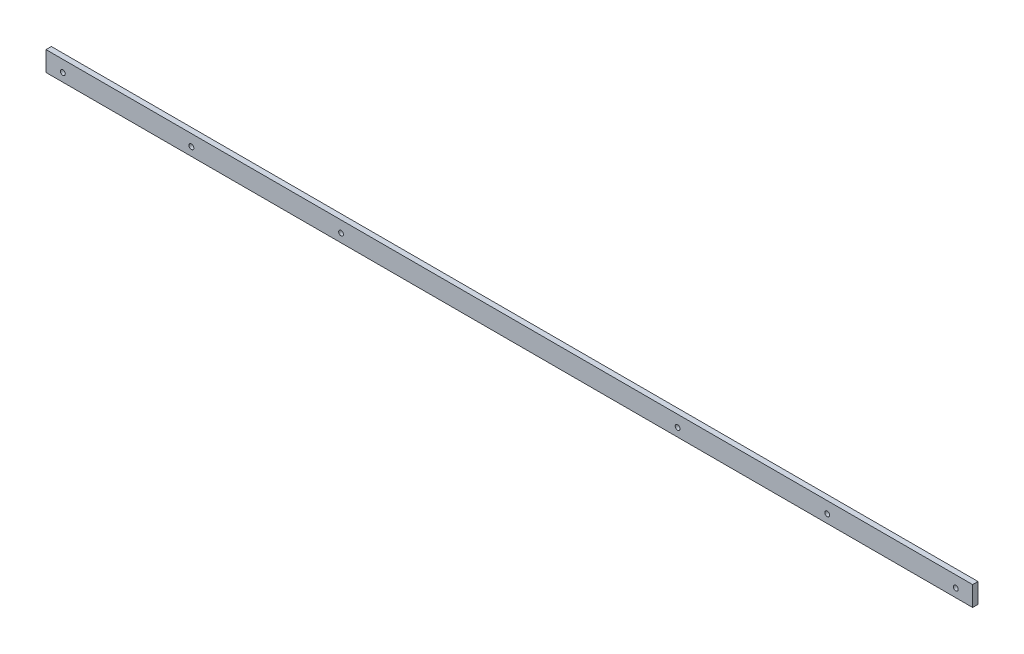
ISO-10303-21;
HEADER;
FILE_DESCRIPTION(('STEP AP214'),'2;1');
FILE_NAME('part.step','',(''),(''),'','','');
FILE_SCHEMA(('AUTOMOTIVE_DESIGN { 1 0 10303 214 1 1 1 1 }'));
ENDSEC;
DATA;
#1=APPLICATION_CONTEXT('core data for automotive mechanical design processes');
#2=APPLICATION_PROTOCOL_DEFINITION('international standard','automotive_design',2000,#1);
#3=PRODUCT_CONTEXT('',#1,'mechanical');
#4=PRODUCT('Part','Part','',(#3));
#5=PRODUCT_RELATED_PRODUCT_CATEGORY('part','',(#4));
#6=PRODUCT_DEFINITION_FORMATION('','',#4);
#7=PRODUCT_DEFINITION_CONTEXT('part definition',#1,'design');
#8=PRODUCT_DEFINITION('design','',#6,#7);
#9=PRODUCT_DEFINITION_SHAPE('','',#8);
#10=(LENGTH_UNIT() NAMED_UNIT(*) SI_UNIT(.MILLI.,.METRE.));
#11=(NAMED_UNIT(*) PLANE_ANGLE_UNIT() SI_UNIT($,.RADIAN.));
#12=(NAMED_UNIT(*) SI_UNIT($,.STERADIAN.) SOLID_ANGLE_UNIT());
#13=UNCERTAINTY_MEASURE_WITH_UNIT(LENGTH_MEASURE(1.E-05),#10,'distance_accuracy_value','');
#14=(GEOMETRIC_REPRESENTATION_CONTEXT(3) GLOBAL_UNCERTAINTY_ASSIGNED_CONTEXT((#13)) GLOBAL_UNIT_ASSIGNED_CONTEXT((#10,
#11,#12)) REPRESENTATION_CONTEXT('',''));
#15=CARTESIAN_POINT('',(0.,0.,0.));
#16=DIRECTION('',(0.,0.,1.));
#17=DIRECTION('',(1.,0.,0.));
#18=AXIS2_PLACEMENT_3D('',#15,#16,#17);
#19=CARTESIAN_POINT('',(275.35,5.9,3.18));
#20=DIRECTION('',(-1.,0.,0.));
#21=DIRECTION('',(0.,0.,1.));
#22=AXIS2_PLACEMENT_3D('',#19,#20,#21);
#23=PLANE('',#22);
#24=DIRECTION('',(0.,1.,0.));
#25=VECTOR('',#24,1.);
#26=CARTESIAN_POINT('',(275.35,5.9,0.));
#27=LINE('',#26,#25);
#28=CARTESIAN_POINT('',(275.35,-5.9,0.));
#29=VERTEX_POINT('',#28);
#30=CARTESIAN_POINT('',(275.35,5.9,0.));
#31=VERTEX_POINT('',#30);
#32=EDGE_CURVE('E100',#29,#31,#27,.T.);
#33=ORIENTED_EDGE('',*,*,#32,.T.);
#34=DIRECTION('',(0.,0.,-1.));
#35=VECTOR('',#34,1.);
#36=CARTESIAN_POINT('',(275.35,5.9,3.18));
#37=LINE('',#36,#35);
#38=CARTESIAN_POINT('',(275.35,5.9,3.18));
#39=VERTEX_POINT('',#38);
#40=EDGE_CURVE('E11',#39,#31,#37,.T.);
#41=ORIENTED_EDGE('',*,*,#40,.F.);
#42=DIRECTION('',(0.,1.,0.));
#43=VECTOR('',#42,1.);
#44=CARTESIAN_POINT('',(275.35,5.9,3.18));
#45=LINE('',#44,#43);
#46=CARTESIAN_POINT('',(275.35,-5.9,3.18));
#47=VERTEX_POINT('',#46);
#48=EDGE_CURVE('E88',#47,#39,#45,.T.);
#49=ORIENTED_EDGE('',*,*,#48,.F.);
#50=DIRECTION('',(0.,0.,-1.));
#51=VECTOR('',#50,1.);
#52=CARTESIAN_POINT('',(275.35,-5.9,3.18));
#53=LINE('',#52,#51);
#54=EDGE_CURVE('E96',#47,#29,#53,.T.);
#55=ORIENTED_EDGE('',*,*,#54,.T.);
#56=EDGE_LOOP('',(#33,#41,#49,#55));
#57=FACE_BOUND('',#56,.T.);
#58=ADVANCED_FACE('F37',(#57),#23,.F.);
#59=CARTESIAN_POINT('',(-275.35,5.9,3.18));
#60=DIRECTION('',(0.,-1.,0.));
#61=DIRECTION('',(0.,0.,-1.));
#62=AXIS2_PLACEMENT_3D('',#59,#60,#61);
#63=PLANE('',#62);
#64=DIRECTION('',(-1.,0.,0.));
#65=VECTOR('',#64,1.);
#66=CARTESIAN_POINT('',(-275.35,5.9,0.));
#67=LINE('',#66,#65);
#68=CARTESIAN_POINT('',(-275.35,5.9,0.));
#69=VERTEX_POINT('',#68);
#70=EDGE_CURVE('E92',#31,#69,#67,.T.);
#71=ORIENTED_EDGE('',*,*,#70,.T.);
#72=DIRECTION('',(0.,0.,-1.));
#73=VECTOR('',#72,1.);
#74=CARTESIAN_POINT('',(-275.35,5.9,3.18));
#75=LINE('',#74,#73);
#76=CARTESIAN_POINT('',(-275.35,5.9,3.18));
#77=VERTEX_POINT('',#76);
#78=EDGE_CURVE('E45',#77,#69,#75,.T.);
#79=ORIENTED_EDGE('',*,*,#78,.F.);
#80=DIRECTION('',(-1.,0.,0.));
#81=VECTOR('',#80,1.);
#82=CARTESIAN_POINT('',(-275.35,5.9,3.18));
#83=LINE('',#82,#81);
#84=EDGE_CURVE('E83',#39,#77,#83,.T.);
#85=ORIENTED_EDGE('',*,*,#84,.F.);
#86=ORIENTED_EDGE('',*,*,#40,.T.);
#87=EDGE_LOOP('',(#71,#79,#85,#86));
#88=FACE_BOUND('',#87,.T.);
#89=ADVANCED_FACE('F91',(#88),#63,.F.);
#90=CARTESIAN_POINT('',(-275.35,5.9,3.18));
#91=DIRECTION('',(1.,0.,0.));
#92=DIRECTION('',(0.,0.,-1.));
#93=AXIS2_PLACEMENT_3D('',#90,#91,#92);
#94=PLANE('',#93);
#95=DIRECTION('',(0.,-1.,0.));
#96=VECTOR('',#95,1.);
#97=CARTESIAN_POINT('',(-275.35,5.9,0.));
#98=LINE('',#97,#96);
#99=CARTESIAN_POINT('',(-275.35,-5.9,0.));
#100=VERTEX_POINT('',#99);
#101=EDGE_CURVE('E70',#69,#100,#98,.T.);
#102=ORIENTED_EDGE('',*,*,#101,.T.);
#103=DIRECTION('',(0.,0.,-1.));
#104=VECTOR('',#103,1.);
#105=CARTESIAN_POINT('',(-275.35,-5.9,3.18));
#106=LINE('',#105,#104);
#107=CARTESIAN_POINT('',(-275.35,-5.9,3.18));
#108=VERTEX_POINT('',#107);
#109=EDGE_CURVE('E93',#108,#100,#106,.T.);
#110=ORIENTED_EDGE('',*,*,#109,.F.);
#111=DIRECTION('',(0.,-1.,0.));
#112=VECTOR('',#111,1.);
#113=CARTESIAN_POINT('',(-275.35,5.9,3.18));
#114=LINE('',#113,#112);
#115=EDGE_CURVE('E86',#77,#108,#114,.T.);
#116=ORIENTED_EDGE('',*,*,#115,.F.);
#117=ORIENTED_EDGE('',*,*,#78,.T.);
#118=EDGE_LOOP('',(#102,#110,#116,#117));
#119=FACE_BOUND('',#118,.T.);
#120=ADVANCED_FACE('F94',(#119),#94,.F.);
#121=CARTESIAN_POINT('',(-275.35,-5.9,3.18));
#122=DIRECTION('',(0.,1.,0.));
#123=DIRECTION('',(0.,0.,1.));
#124=AXIS2_PLACEMENT_3D('',#121,#122,#123);
#125=PLANE('',#124);
#126=DIRECTION('',(1.,0.,0.));
#127=VECTOR('',#126,1.);
#128=CARTESIAN_POINT('',(-275.35,-5.9,0.));
#129=LINE('',#128,#127);
#130=EDGE_CURVE('E76',#100,#29,#129,.T.);
#131=ORIENTED_EDGE('',*,*,#130,.T.);
#132=ORIENTED_EDGE('',*,*,#54,.F.);
#133=DIRECTION('',(1.,0.,0.));
#134=VECTOR('',#133,1.);
#135=CARTESIAN_POINT('',(-275.35,-5.9,3.18));
#136=LINE('',#135,#134);
#137=EDGE_CURVE('E53',#108,#47,#136,.T.);
#138=ORIENTED_EDGE('',*,*,#137,.F.);
#139=ORIENTED_EDGE('',*,*,#109,.T.);
#140=EDGE_LOOP('',(#131,#132,#138,#139));
#141=FACE_BOUND('',#140,.T.);
#142=ADVANCED_FACE('F108',(#141),#125,.F.);
#143=CARTESIAN_POINT('',(0.,0.,3.18));
#144=DIRECTION('',(0.,0.,1.));
#145=DIRECTION('',(1.,0.,0.));
#146=AXIS2_PLACEMENT_3D('',#143,#144,#145);
#147=PLANE('',#146);
#148=CARTESIAN_POINT('',(188.94,-0.900000000000001,3.18));
#149=DIRECTION('',(0.,0.,-1.));
#150=DIRECTION('',(-1.,0.,0.));
#151=AXIS2_PLACEMENT_3D('',#148,#149,#150);
#152=CIRCLE('',#151,1.45);
#153=CARTESIAN_POINT('',(190.39,-0.900000000000001,3.18));
#154=VERTEX_POINT('',#153);
#155=EDGE_CURVE('E143',#154,#154,#152,.T.);
#156=ORIENTED_EDGE('',*,*,#155,.T.);
#157=EDGE_LOOP('',(#156));
#158=FACE_BOUND('',#157,.T.);
#159=CARTESIAN_POINT('',(-188.94,-0.900000000000001,3.18));
#160=DIRECTION('',(0.,0.,1.));
#161=DIRECTION('',(1.,0.,0.));
#162=AXIS2_PLACEMENT_3D('',#159,#160,#161);
#163=CIRCLE('',#162,1.45);
#164=CARTESIAN_POINT('',(-187.49,-0.900000000000001,3.18));
#165=VERTEX_POINT('',#164);
#166=EDGE_CURVE('E140',#165,#165,#163,.T.);
#167=ORIENTED_EDGE('',*,*,#166,.F.);
#168=EDGE_LOOP('',(#167));
#169=FACE_BOUND('',#168,.T.);
#170=CARTESIAN_POINT('',(-265.35,-0.900000000000001,3.18));
#171=DIRECTION('',(0.,0.,-1.));
#172=DIRECTION('',(-1.,0.,0.));
#173=AXIS2_PLACEMENT_3D('',#170,#171,#172);
#174=CIRCLE('',#173,1.45);
#175=CARTESIAN_POINT('',(-263.9,-0.900000000000001,3.18));
#176=VERTEX_POINT('',#175);
#177=EDGE_CURVE('E131',#176,#176,#174,.T.);
#178=ORIENTED_EDGE('',*,*,#177,.T.);
#179=EDGE_LOOP('',(#178));
#180=FACE_BOUND('',#179,.T.);
#181=CARTESIAN_POINT('',(265.35,-0.900000000000001,3.18));
#182=DIRECTION('',(0.,0.,1.));
#183=DIRECTION('',(1.,0.,0.));
#184=AXIS2_PLACEMENT_3D('',#181,#182,#183);
#185=CIRCLE('',#184,1.45);
#186=CARTESIAN_POINT('',(266.8,-0.900000000000001,3.18));
#187=VERTEX_POINT('',#186);
#188=EDGE_CURVE('E128',#187,#187,#185,.T.);
#189=ORIENTED_EDGE('',*,*,#188,.F.);
#190=EDGE_LOOP('',(#189));
#191=FACE_BOUND('',#190,.T.);
#192=CARTESIAN_POINT('',(-100.,-0.900000000000001,3.18));
#193=DIRECTION('',(0.,0.,-1.));
#194=DIRECTION('',(-1.,0.,0.));
#195=AXIS2_PLACEMENT_3D('',#192,#193,#194);
#196=CIRCLE('',#195,1.425);
#197=CARTESIAN_POINT('',(-98.575,-0.900000000000001,3.18));
#198=VERTEX_POINT('',#197);
#199=EDGE_CURVE('E119',#198,#198,#196,.T.);
#200=ORIENTED_EDGE('',*,*,#199,.T.);
#201=EDGE_LOOP('',(#200));
#202=FACE_BOUND('',#201,.T.);
#203=CARTESIAN_POINT('',(100.,-0.900000000000001,3.18));
#204=DIRECTION('',(0.,0.,1.));
#205=DIRECTION('',(1.,0.,0.));
#206=AXIS2_PLACEMENT_3D('',#203,#204,#205);
#207=CIRCLE('',#206,1.425);
#208=CARTESIAN_POINT('',(101.425,-0.900000000000001,3.18));
#209=VERTEX_POINT('',#208);
#210=EDGE_CURVE('E116',#209,#209,#207,.T.);
#211=ORIENTED_EDGE('',*,*,#210,.F.);
#212=EDGE_LOOP('',(#211));
#213=FACE_BOUND('',#212,.T.);
#214=ORIENTED_EDGE('',*,*,#48,.T.);
#215=ORIENTED_EDGE('',*,*,#84,.T.);
#216=ORIENTED_EDGE('',*,*,#115,.T.);
#217=ORIENTED_EDGE('',*,*,#137,.T.);
#218=EDGE_LOOP('',(#214,#215,#216,#217));
#219=FACE_BOUND('',#218,.T.);
#220=ADVANCED_FACE('F84',(#158,#169,#180,#191,#202,#213,#219),#147,.T.);
#221=CARTESIAN_POINT('',(0.,0.,0.));
#222=DIRECTION('',(0.,0.,1.));
#223=DIRECTION('',(1.,0.,0.));
#224=AXIS2_PLACEMENT_3D('',#221,#222,#223);
#225=PLANE('',#224);
#226=CARTESIAN_POINT('',(188.94,-0.900000000000001,0.));
#227=DIRECTION('',(0.,0.,1.));
#228=DIRECTION('',(1.,0.,0.));
#229=AXIS2_PLACEMENT_3D('',#226,#227,#228);
#230=CIRCLE('',#229,1.45);
#231=CARTESIAN_POINT('',(190.39,-0.900000000000001,0.));
#232=VERTEX_POINT('',#231);
#233=EDGE_CURVE('E144',#232,#232,#230,.T.);
#234=ORIENTED_EDGE('',*,*,#233,.T.);
#235=EDGE_LOOP('',(#234));
#236=FACE_BOUND('',#235,.T.);
#237=CARTESIAN_POINT('',(-188.94,-0.900000000000001,0.));
#238=DIRECTION('',(0.,0.,1.));
#239=DIRECTION('',(1.,0.,0.));
#240=AXIS2_PLACEMENT_3D('',#237,#238,#239);
#241=CIRCLE('',#240,1.45);
#242=CARTESIAN_POINT('',(-187.49,-0.900000000000001,0.));
#243=VERTEX_POINT('',#242);
#244=EDGE_CURVE('E135',#243,#243,#241,.F.);
#245=ORIENTED_EDGE('',*,*,#244,.F.);
#246=EDGE_LOOP('',(#245));
#247=FACE_BOUND('',#246,.T.);
#248=CARTESIAN_POINT('',(-265.35,-0.900000000000001,0.));
#249=DIRECTION('',(0.,0.,1.));
#250=DIRECTION('',(1.,0.,0.));
#251=AXIS2_PLACEMENT_3D('',#248,#249,#250);
#252=CIRCLE('',#251,1.45);
#253=CARTESIAN_POINT('',(-263.9,-0.900000000000001,0.));
#254=VERTEX_POINT('',#253);
#255=EDGE_CURVE('E132',#254,#254,#252,.T.);
#256=ORIENTED_EDGE('',*,*,#255,.T.);
#257=EDGE_LOOP('',(#256));
#258=FACE_BOUND('',#257,.T.);
#259=CARTESIAN_POINT('',(265.35,-0.900000000000001,0.));
#260=DIRECTION('',(0.,0.,1.));
#261=DIRECTION('',(1.,0.,0.));
#262=AXIS2_PLACEMENT_3D('',#259,#260,#261);
#263=CIRCLE('',#262,1.45);
#264=CARTESIAN_POINT('',(266.8,-0.900000000000001,0.));
#265=VERTEX_POINT('',#264);
#266=EDGE_CURVE('E123',#265,#265,#263,.F.);
#267=ORIENTED_EDGE('',*,*,#266,.F.);
#268=EDGE_LOOP('',(#267));
#269=FACE_BOUND('',#268,.T.);
#270=CARTESIAN_POINT('',(-100.,-0.900000000000001,0.));
#271=DIRECTION('',(0.,0.,1.));
#272=DIRECTION('',(1.,0.,0.));
#273=AXIS2_PLACEMENT_3D('',#270,#271,#272);
#274=CIRCLE('',#273,1.425);
#275=CARTESIAN_POINT('',(-98.575,-0.900000000000001,0.));
#276=VERTEX_POINT('',#275);
#277=EDGE_CURVE('E120',#276,#276,#274,.T.);
#278=ORIENTED_EDGE('',*,*,#277,.T.);
#279=EDGE_LOOP('',(#278));
#280=FACE_BOUND('',#279,.T.);
#281=CARTESIAN_POINT('',(100.,-0.900000000000001,0.));
#282=DIRECTION('',(0.,0.,1.));
#283=DIRECTION('',(1.,0.,0.));
#284=AXIS2_PLACEMENT_3D('',#281,#282,#283);
#285=CIRCLE('',#284,1.425);
#286=CARTESIAN_POINT('',(101.425,-0.900000000000001,0.));
#287=VERTEX_POINT('',#286);
#288=EDGE_CURVE('E103',#287,#287,#285,.F.);
#289=ORIENTED_EDGE('',*,*,#288,.F.);
#290=EDGE_LOOP('',(#289));
#291=FACE_BOUND('',#290,.T.);
#292=ORIENTED_EDGE('',*,*,#32,.F.);
#293=ORIENTED_EDGE('',*,*,#130,.F.);
#294=ORIENTED_EDGE('',*,*,#101,.F.);
#295=ORIENTED_EDGE('',*,*,#70,.F.);
#296=EDGE_LOOP('',(#292,#293,#294,#295));
#297=FACE_BOUND('',#296,.T.);
#298=ADVANCED_FACE('F111',(#236,#247,#258,#269,#280,#291,#297),#225,.F.);
#299=CARTESIAN_POINT('',(100.,-0.900000000000001,-0.00100000000000013));
#300=DIRECTION('',(0.,0.,1.));
#301=DIRECTION('',(1.,0.,0.));
#302=AXIS2_PLACEMENT_3D('',#299,#300,#301);
#303=CYLINDRICAL_SURFACE('',#302,1.425);
#304=CARTESIAN_POINT('',(101.425,-0.900000000000001,3.18));
#305=CARTESIAN_POINT('',(101.425,-0.900000000000001,3.146875));
#306=CARTESIAN_POINT('',(101.425,-0.900000000000001,3.11375));
#307=CARTESIAN_POINT('',(101.425,-0.900000000000001,3.0475));
#308=CARTESIAN_POINT('',(101.425,-0.900000000000001,3.014375));
#309=CARTESIAN_POINT('',(101.425,-0.900000000000001,2.948125));
#310=CARTESIAN_POINT('',(101.425,-0.900000000000001,2.915));
#311=CARTESIAN_POINT('',(101.425,-0.900000000000001,2.84875));
#312=CARTESIAN_POINT('',(101.425,-0.900000000000001,2.815625));
#313=CARTESIAN_POINT('',(101.425,-0.900000000000001,2.749375));
#314=CARTESIAN_POINT('',(101.425,-0.900000000000001,2.71625));
#315=CARTESIAN_POINT('',(101.425,-0.900000000000001,2.65));
#316=CARTESIAN_POINT('',(101.425,-0.900000000000001,2.616875));
#317=CARTESIAN_POINT('',(101.425,-0.900000000000001,2.550625));
#318=CARTESIAN_POINT('',(101.425,-0.900000000000001,2.5175));
#319=CARTESIAN_POINT('',(101.425,-0.900000000000001,2.45125));
#320=CARTESIAN_POINT('',(101.425,-0.900000000000001,2.418125));
#321=CARTESIAN_POINT('',(101.425,-0.900000000000001,2.351875));
#322=CARTESIAN_POINT('',(101.425,-0.900000000000001,2.31875));
#323=CARTESIAN_POINT('',(101.425,-0.900000000000001,2.2525));
#324=CARTESIAN_POINT('',(101.425,-0.900000000000001,2.219375));
#325=CARTESIAN_POINT('',(101.425,-0.900000000000001,2.153125));
#326=CARTESIAN_POINT('',(101.425,-0.900000000000001,2.12));
#327=CARTESIAN_POINT('',(101.425,-0.900000000000001,2.05375));
#328=CARTESIAN_POINT('',(101.425,-0.900000000000001,2.020625));
#329=CARTESIAN_POINT('',(101.425,-0.900000000000001,1.954375));
#330=CARTESIAN_POINT('',(101.425,-0.900000000000001,1.92125));
#331=CARTESIAN_POINT('',(101.425,-0.900000000000001,1.855));
#332=CARTESIAN_POINT('',(101.425,-0.900000000000001,1.821875));
#333=CARTESIAN_POINT('',(101.425,-0.900000000000001,1.755625));
#334=CARTESIAN_POINT('',(101.425,-0.900000000000001,1.7225));
#335=CARTESIAN_POINT('',(101.425,-0.900000000000001,1.65625));
#336=CARTESIAN_POINT('',(101.425,-0.900000000000001,1.623125));
#337=CARTESIAN_POINT('',(101.425,-0.900000000000001,1.556875));
#338=CARTESIAN_POINT('',(101.425,-0.900000000000001,1.52375));
#339=CARTESIAN_POINT('',(101.425,-0.900000000000001,1.4575));
#340=CARTESIAN_POINT('',(101.425,-0.900000000000001,1.424375));
#341=CARTESIAN_POINT('',(101.425,-0.900000000000001,1.358125));
#342=CARTESIAN_POINT('',(101.425,-0.900000000000001,1.325));
#343=CARTESIAN_POINT('',(101.425,-0.900000000000001,1.25875));
#344=CARTESIAN_POINT('',(101.425,-0.900000000000001,1.225625));
#345=CARTESIAN_POINT('',(101.425,-0.900000000000001,1.159375));
#346=CARTESIAN_POINT('',(101.425,-0.900000000000001,1.12625));
#347=CARTESIAN_POINT('',(101.425,-0.900000000000001,1.06));
#348=CARTESIAN_POINT('',(101.425,-0.900000000000001,1.026875));
#349=CARTESIAN_POINT('',(101.425,-0.900000000000001,0.960625));
#350=CARTESIAN_POINT('',(101.425,-0.900000000000001,0.9275));
#351=CARTESIAN_POINT('',(101.425,-0.900000000000001,0.86125));
#352=CARTESIAN_POINT('',(101.425,-0.900000000000001,0.828125));
#353=CARTESIAN_POINT('',(101.425,-0.900000000000001,0.761875));
#354=CARTESIAN_POINT('',(101.425,-0.900000000000001,0.72875));
#355=CARTESIAN_POINT('',(101.425,-0.900000000000001,0.6625));
#356=CARTESIAN_POINT('',(101.425,-0.900000000000001,0.629375));
#357=CARTESIAN_POINT('',(101.425,-0.900000000000001,0.563125));
#358=CARTESIAN_POINT('',(101.425,-0.900000000000001,0.53));
#359=CARTESIAN_POINT('',(101.425,-0.900000000000001,0.46375));
#360=CARTESIAN_POINT('',(101.425,-0.900000000000001,0.430625));
#361=CARTESIAN_POINT('',(101.425,-0.900000000000001,0.364375));
#362=CARTESIAN_POINT('',(101.425,-0.900000000000001,0.33125));
#363=CARTESIAN_POINT('',(101.425,-0.900000000000001,0.265));
#364=CARTESIAN_POINT('',(101.425,-0.900000000000001,0.231875));
#365=CARTESIAN_POINT('',(101.425,-0.900000000000001,0.165625));
#366=CARTESIAN_POINT('',(101.425,-0.900000000000001,0.1325));
#367=CARTESIAN_POINT('',(101.425,-0.900000000000001,0.06625));
#368=CARTESIAN_POINT('',(101.425,-0.900000000000001,0.033125));
#369=CARTESIAN_POINT('',(101.425,-0.900000000000001,0.));
#370=B_SPLINE_CURVE_WITH_KNOTS('',3,(#304,#305,#306,#307,#308,#309,#310,#311,#312,#313,#314,
#315,#316,#317,#318,#319,#320,#321,#322,#323,#324,#325,#326,#327,#328,#329,#330,#331,#332,#333,
#334,#335,#336,#337,#338,#339,#340,#341,#342,#343,#344,#345,#346,#347,#348,#349,#350,#351,#352,
#353,#354,#355,#356,#357,#358,#359,#360,#361,#362,#363,#364,#365,#366,#367,#368,#369),
.UNSPECIFIED.,.F.,.F.,(4,2,2,2,2,2,2,2,2,2,2,2,2,2,2,2,2,2,2,2,2,2,2,2,2,2,2,2,2,2,2,2,4),(0.,
0.0993750000000001,0.19875,0.298125,0.3975,0.496875,0.59625,0.695625,0.795,0.894375,0.99375,
1.093125,1.1925,1.291875,1.39125,1.490625,1.59,1.689375,1.78875,1.888125,1.9875,2.086875,
2.18625,2.285625,2.385,2.484375,2.58375,2.683125,2.7825,2.881875,2.98125,3.080625,3.18),.UNSPECIFIED.);
#371=EDGE_CURVE('BSEAM161',#209,#287,#370,.T.);
#372=ORIENTED_EDGE('',*,*,#210,.T.);
#373=ORIENTED_EDGE('',*,*,#288,.T.);
#374=ORIENTED_EDGE('',*,*,#371,.T.);
#375=ORIENTED_EDGE('',*,*,#371,.F.);
#376=EDGE_LOOP('',(#372,#374,#373,#375));
#377=FACE_BOUND('',#376,.T.);
#378=ADVANCED_FACE('F161',(#377),#303,.F.);
#379=CARTESIAN_POINT('',(-100.,-0.900000000000001,-0.00100000000000013));
#380=DIRECTION('',(0.,0.,1.));
#381=DIRECTION('',(1.,0.,0.));
#382=AXIS2_PLACEMENT_3D('',#379,#380,#381);
#383=CYLINDRICAL_SURFACE('',#382,1.425);
#384=CARTESIAN_POINT('',(-98.575,-0.900000000000001,3.18));
#385=CARTESIAN_POINT('',(-98.575,-0.900000000000001,3.146875));
#386=CARTESIAN_POINT('',(-98.575,-0.900000000000001,3.11375));
#387=CARTESIAN_POINT('',(-98.575,-0.900000000000001,3.0475));
#388=CARTESIAN_POINT('',(-98.575,-0.900000000000001,3.014375));
#389=CARTESIAN_POINT('',(-98.575,-0.900000000000001,2.948125));
#390=CARTESIAN_POINT('',(-98.575,-0.900000000000001,2.915));
#391=CARTESIAN_POINT('',(-98.575,-0.900000000000001,2.84875));
#392=CARTESIAN_POINT('',(-98.575,-0.900000000000001,2.815625));
#393=CARTESIAN_POINT('',(-98.575,-0.900000000000001,2.749375));
#394=CARTESIAN_POINT('',(-98.575,-0.900000000000001,2.71625));
#395=CARTESIAN_POINT('',(-98.575,-0.900000000000001,2.65));
#396=CARTESIAN_POINT('',(-98.575,-0.900000000000001,2.616875));
#397=CARTESIAN_POINT('',(-98.575,-0.900000000000001,2.550625));
#398=CARTESIAN_POINT('',(-98.575,-0.900000000000001,2.5175));
#399=CARTESIAN_POINT('',(-98.575,-0.900000000000001,2.45125));
#400=CARTESIAN_POINT('',(-98.575,-0.900000000000001,2.418125));
#401=CARTESIAN_POINT('',(-98.575,-0.900000000000001,2.351875));
#402=CARTESIAN_POINT('',(-98.575,-0.900000000000001,2.31875));
#403=CARTESIAN_POINT('',(-98.575,-0.900000000000001,2.2525));
#404=CARTESIAN_POINT('',(-98.575,-0.900000000000001,2.219375));
#405=CARTESIAN_POINT('',(-98.575,-0.900000000000001,2.153125));
#406=CARTESIAN_POINT('',(-98.575,-0.900000000000001,2.12));
#407=CARTESIAN_POINT('',(-98.575,-0.900000000000001,2.05375));
#408=CARTESIAN_POINT('',(-98.575,-0.900000000000001,2.020625));
#409=CARTESIAN_POINT('',(-98.575,-0.900000000000001,1.954375));
#410=CARTESIAN_POINT('',(-98.575,-0.900000000000001,1.92125));
#411=CARTESIAN_POINT('',(-98.575,-0.900000000000001,1.855));
#412=CARTESIAN_POINT('',(-98.575,-0.900000000000001,1.821875));
#413=CARTESIAN_POINT('',(-98.575,-0.900000000000001,1.755625));
#414=CARTESIAN_POINT('',(-98.575,-0.900000000000001,1.7225));
#415=CARTESIAN_POINT('',(-98.575,-0.900000000000001,1.65625));
#416=CARTESIAN_POINT('',(-98.575,-0.900000000000001,1.623125));
#417=CARTESIAN_POINT('',(-98.575,-0.900000000000001,1.556875));
#418=CARTESIAN_POINT('',(-98.575,-0.900000000000001,1.52375));
#419=CARTESIAN_POINT('',(-98.575,-0.900000000000001,1.4575));
#420=CARTESIAN_POINT('',(-98.575,-0.900000000000001,1.424375));
#421=CARTESIAN_POINT('',(-98.575,-0.900000000000001,1.358125));
#422=CARTESIAN_POINT('',(-98.575,-0.900000000000001,1.325));
#423=CARTESIAN_POINT('',(-98.575,-0.900000000000001,1.25875));
#424=CARTESIAN_POINT('',(-98.575,-0.900000000000001,1.225625));
#425=CARTESIAN_POINT('',(-98.575,-0.900000000000001,1.159375));
#426=CARTESIAN_POINT('',(-98.575,-0.900000000000001,1.12625));
#427=CARTESIAN_POINT('',(-98.575,-0.900000000000001,1.06));
#428=CARTESIAN_POINT('',(-98.575,-0.900000000000001,1.026875));
#429=CARTESIAN_POINT('',(-98.575,-0.900000000000001,0.960625));
#430=CARTESIAN_POINT('',(-98.575,-0.900000000000001,0.9275));
#431=CARTESIAN_POINT('',(-98.575,-0.900000000000001,0.86125));
#432=CARTESIAN_POINT('',(-98.575,-0.900000000000001,0.828125));
#433=CARTESIAN_POINT('',(-98.575,-0.900000000000001,0.761875));
#434=CARTESIAN_POINT('',(-98.575,-0.900000000000001,0.72875));
#435=CARTESIAN_POINT('',(-98.575,-0.900000000000001,0.6625));
#436=CARTESIAN_POINT('',(-98.575,-0.900000000000001,0.629375));
#437=CARTESIAN_POINT('',(-98.575,-0.900000000000001,0.563125));
#438=CARTESIAN_POINT('',(-98.575,-0.900000000000001,0.53));
#439=CARTESIAN_POINT('',(-98.575,-0.900000000000001,0.46375));
#440=CARTESIAN_POINT('',(-98.575,-0.900000000000001,0.430625));
#441=CARTESIAN_POINT('',(-98.575,-0.900000000000001,0.364375));
#442=CARTESIAN_POINT('',(-98.575,-0.900000000000001,0.33125));
#443=CARTESIAN_POINT('',(-98.575,-0.900000000000001,0.265));
#444=CARTESIAN_POINT('',(-98.575,-0.900000000000001,0.231875));
#445=CARTESIAN_POINT('',(-98.575,-0.900000000000001,0.165625));
#446=CARTESIAN_POINT('',(-98.575,-0.900000000000001,0.1325));
#447=CARTESIAN_POINT('',(-98.575,-0.900000000000001,0.06625));
#448=CARTESIAN_POINT('',(-98.575,-0.900000000000001,0.033125));
#449=CARTESIAN_POINT('',(-98.575,-0.900000000000001,0.));
#450=B_SPLINE_CURVE_WITH_KNOTS('',3,(#384,#385,#386,#387,#388,#389,#390,#391,#392,#393,#394,
#395,#396,#397,#398,#399,#400,#401,#402,#403,#404,#405,#406,#407,#408,#409,#410,#411,#412,#413,
#414,#415,#416,#417,#418,#419,#420,#421,#422,#423,#424,#425,#426,#427,#428,#429,#430,#431,#432,
#433,#434,#435,#436,#437,#438,#439,#440,#441,#442,#443,#444,#445,#446,#447,#448,#449),
.UNSPECIFIED.,.F.,.F.,(4,2,2,2,2,2,2,2,2,2,2,2,2,2,2,2,2,2,2,2,2,2,2,2,2,2,2,2,2,2,2,2,4),(0.,
0.0993750000000001,0.19875,0.298125,0.3975,0.496875,0.59625,0.695625,0.795,0.894375,0.99375,
1.093125,1.1925,1.291875,1.39125,1.490625,1.59,1.689375,1.78875,1.888125,1.9875,2.086875,
2.18625,2.285625,2.385,2.484375,2.58375,2.683125,2.7825,2.881875,2.98125,3.080625,3.18),.UNSPECIFIED.);
#451=EDGE_CURVE('BSEAM174',#198,#276,#450,.T.);
#452=ORIENTED_EDGE('',*,*,#199,.F.);
#453=ORIENTED_EDGE('',*,*,#277,.F.);
#454=ORIENTED_EDGE('',*,*,#451,.T.);
#455=ORIENTED_EDGE('',*,*,#451,.F.);
#456=EDGE_LOOP('',(#452,#454,#453,#455));
#457=FACE_BOUND('',#456,.T.);
#458=ADVANCED_FACE('F174',(#457),#383,.F.);
#459=CARTESIAN_POINT('',(265.35,-0.900000000000001,-0.00100000000000013));
#460=DIRECTION('',(0.,0.,1.));
#461=DIRECTION('',(1.,0.,0.));
#462=AXIS2_PLACEMENT_3D('',#459,#460,#461);
#463=CYLINDRICAL_SURFACE('',#462,1.45);
#464=CARTESIAN_POINT('',(266.8,-0.900000000000001,3.18));
#465=CARTESIAN_POINT('',(266.8,-0.900000000000001,3.146875));
#466=CARTESIAN_POINT('',(266.8,-0.900000000000001,3.11375));
#467=CARTESIAN_POINT('',(266.8,-0.900000000000001,3.0475));
#468=CARTESIAN_POINT('',(266.8,-0.900000000000001,3.014375));
#469=CARTESIAN_POINT('',(266.8,-0.900000000000001,2.948125));
#470=CARTESIAN_POINT('',(266.8,-0.900000000000001,2.915));
#471=CARTESIAN_POINT('',(266.8,-0.900000000000001,2.84875));
#472=CARTESIAN_POINT('',(266.8,-0.900000000000001,2.815625));
#473=CARTESIAN_POINT('',(266.8,-0.900000000000001,2.749375));
#474=CARTESIAN_POINT('',(266.8,-0.900000000000001,2.71625));
#475=CARTESIAN_POINT('',(266.8,-0.900000000000001,2.65));
#476=CARTESIAN_POINT('',(266.8,-0.900000000000001,2.616875));
#477=CARTESIAN_POINT('',(266.8,-0.900000000000001,2.550625));
#478=CARTESIAN_POINT('',(266.8,-0.900000000000001,2.5175));
#479=CARTESIAN_POINT('',(266.8,-0.900000000000001,2.45125));
#480=CARTESIAN_POINT('',(266.8,-0.900000000000001,2.418125));
#481=CARTESIAN_POINT('',(266.8,-0.900000000000001,2.351875));
#482=CARTESIAN_POINT('',(266.8,-0.900000000000001,2.31875));
#483=CARTESIAN_POINT('',(266.8,-0.900000000000001,2.2525));
#484=CARTESIAN_POINT('',(266.8,-0.900000000000001,2.219375));
#485=CARTESIAN_POINT('',(266.8,-0.900000000000001,2.153125));
#486=CARTESIAN_POINT('',(266.8,-0.900000000000001,2.12));
#487=CARTESIAN_POINT('',(266.8,-0.900000000000001,2.05375));
#488=CARTESIAN_POINT('',(266.8,-0.900000000000001,2.020625));
#489=CARTESIAN_POINT('',(266.8,-0.900000000000001,1.954375));
#490=CARTESIAN_POINT('',(266.8,-0.900000000000001,1.92125));
#491=CARTESIAN_POINT('',(266.8,-0.900000000000001,1.855));
#492=CARTESIAN_POINT('',(266.8,-0.900000000000001,1.821875));
#493=CARTESIAN_POINT('',(266.8,-0.900000000000001,1.755625));
#494=CARTESIAN_POINT('',(266.8,-0.900000000000001,1.7225));
#495=CARTESIAN_POINT('',(266.8,-0.900000000000001,1.65625));
#496=CARTESIAN_POINT('',(266.8,-0.900000000000001,1.623125));
#497=CARTESIAN_POINT('',(266.8,-0.900000000000001,1.556875));
#498=CARTESIAN_POINT('',(266.8,-0.900000000000001,1.52375));
#499=CARTESIAN_POINT('',(266.8,-0.900000000000001,1.4575));
#500=CARTESIAN_POINT('',(266.8,-0.900000000000001,1.424375));
#501=CARTESIAN_POINT('',(266.8,-0.900000000000001,1.358125));
#502=CARTESIAN_POINT('',(266.8,-0.900000000000001,1.325));
#503=CARTESIAN_POINT('',(266.8,-0.900000000000001,1.25875));
#504=CARTESIAN_POINT('',(266.8,-0.900000000000001,1.225625));
#505=CARTESIAN_POINT('',(266.8,-0.900000000000001,1.159375));
#506=CARTESIAN_POINT('',(266.8,-0.900000000000001,1.12625));
#507=CARTESIAN_POINT('',(266.8,-0.900000000000001,1.06));
#508=CARTESIAN_POINT('',(266.8,-0.900000000000001,1.026875));
#509=CARTESIAN_POINT('',(266.8,-0.900000000000001,0.960625));
#510=CARTESIAN_POINT('',(266.8,-0.900000000000001,0.9275));
#511=CARTESIAN_POINT('',(266.8,-0.900000000000001,0.86125));
#512=CARTESIAN_POINT('',(266.8,-0.900000000000001,0.828125));
#513=CARTESIAN_POINT('',(266.8,-0.900000000000001,0.761875));
#514=CARTESIAN_POINT('',(266.8,-0.900000000000001,0.72875));
#515=CARTESIAN_POINT('',(266.8,-0.900000000000001,0.6625));
#516=CARTESIAN_POINT('',(266.8,-0.900000000000001,0.629375));
#517=CARTESIAN_POINT('',(266.8,-0.900000000000001,0.563125));
#518=CARTESIAN_POINT('',(266.8,-0.900000000000001,0.53));
#519=CARTESIAN_POINT('',(266.8,-0.900000000000001,0.46375));
#520=CARTESIAN_POINT('',(266.8,-0.900000000000001,0.430625));
#521=CARTESIAN_POINT('',(266.8,-0.900000000000001,0.364375));
#522=CARTESIAN_POINT('',(266.8,-0.900000000000001,0.33125));
#523=CARTESIAN_POINT('',(266.8,-0.900000000000001,0.265));
#524=CARTESIAN_POINT('',(266.8,-0.900000000000001,0.231875));
#525=CARTESIAN_POINT('',(266.8,-0.900000000000001,0.165625));
#526=CARTESIAN_POINT('',(266.8,-0.900000000000001,0.1325));
#527=CARTESIAN_POINT('',(266.8,-0.900000000000001,0.06625));
#528=CARTESIAN_POINT('',(266.8,-0.900000000000001,0.033125));
#529=CARTESIAN_POINT('',(266.8,-0.900000000000001,0.));
#530=B_SPLINE_CURVE_WITH_KNOTS('',3,(#464,#465,#466,#467,#468,#469,#470,#471,#472,#473,#474,
#475,#476,#477,#478,#479,#480,#481,#482,#483,#484,#485,#486,#487,#488,#489,#490,#491,#492,#493,
#494,#495,#496,#497,#498,#499,#500,#501,#502,#503,#504,#505,#506,#507,#508,#509,#510,#511,#512,
#513,#514,#515,#516,#517,#518,#519,#520,#521,#522,#523,#524,#525,#526,#527,#528,#529),
.UNSPECIFIED.,.F.,.F.,(4,2,2,2,2,2,2,2,2,2,2,2,2,2,2,2,2,2,2,2,2,2,2,2,2,2,2,2,2,2,2,2,4),(0.,
0.0993750000000001,0.19875,0.298125,0.3975,0.496875,0.59625,0.695625,0.795,0.894375,0.99375,
1.093125,1.1925,1.291875,1.39125,1.490625,1.59,1.689375,1.78875,1.888125,1.9875,2.086875,
2.18625,2.285625,2.385,2.484375,2.58375,2.683125,2.7825,2.881875,2.98125,3.080625,3.18),.UNSPECIFIED.);
#531=EDGE_CURVE('BSEAM180',#187,#265,#530,.T.);
#532=ORIENTED_EDGE('',*,*,#188,.T.);
#533=ORIENTED_EDGE('',*,*,#266,.T.);
#534=ORIENTED_EDGE('',*,*,#531,.T.);
#535=ORIENTED_EDGE('',*,*,#531,.F.);
#536=EDGE_LOOP('',(#532,#534,#533,#535));
#537=FACE_BOUND('',#536,.T.);
#538=ADVANCED_FACE('F180',(#537),#463,.F.);
#539=CARTESIAN_POINT('',(-265.35,-0.900000000000001,-0.00100000000000013));
#540=DIRECTION('',(0.,0.,1.));
#541=DIRECTION('',(1.,0.,0.));
#542=AXIS2_PLACEMENT_3D('',#539,#540,#541);
#543=CYLINDRICAL_SURFACE('',#542,1.45);
#544=CARTESIAN_POINT('',(-263.9,-0.900000000000001,3.18));
#545=CARTESIAN_POINT('',(-263.9,-0.900000000000001,3.146875));
#546=CARTESIAN_POINT('',(-263.9,-0.900000000000001,3.11375));
#547=CARTESIAN_POINT('',(-263.9,-0.900000000000001,3.0475));
#548=CARTESIAN_POINT('',(-263.9,-0.900000000000001,3.014375));
#549=CARTESIAN_POINT('',(-263.9,-0.900000000000001,2.948125));
#550=CARTESIAN_POINT('',(-263.9,-0.900000000000001,2.915));
#551=CARTESIAN_POINT('',(-263.9,-0.900000000000001,2.84875));
#552=CARTESIAN_POINT('',(-263.9,-0.900000000000001,2.815625));
#553=CARTESIAN_POINT('',(-263.9,-0.900000000000001,2.749375));
#554=CARTESIAN_POINT('',(-263.9,-0.900000000000001,2.71625));
#555=CARTESIAN_POINT('',(-263.9,-0.900000000000001,2.65));
#556=CARTESIAN_POINT('',(-263.9,-0.900000000000001,2.616875));
#557=CARTESIAN_POINT('',(-263.9,-0.900000000000001,2.550625));
#558=CARTESIAN_POINT('',(-263.9,-0.900000000000001,2.5175));
#559=CARTESIAN_POINT('',(-263.9,-0.900000000000001,2.45125));
#560=CARTESIAN_POINT('',(-263.9,-0.900000000000001,2.418125));
#561=CARTESIAN_POINT('',(-263.9,-0.900000000000001,2.351875));
#562=CARTESIAN_POINT('',(-263.9,-0.900000000000001,2.31875));
#563=CARTESIAN_POINT('',(-263.9,-0.900000000000001,2.2525));
#564=CARTESIAN_POINT('',(-263.9,-0.900000000000001,2.219375));
#565=CARTESIAN_POINT('',(-263.9,-0.900000000000001,2.153125));
#566=CARTESIAN_POINT('',(-263.9,-0.900000000000001,2.12));
#567=CARTESIAN_POINT('',(-263.9,-0.900000000000001,2.05375));
#568=CARTESIAN_POINT('',(-263.9,-0.900000000000001,2.020625));
#569=CARTESIAN_POINT('',(-263.9,-0.900000000000001,1.954375));
#570=CARTESIAN_POINT('',(-263.9,-0.900000000000001,1.92125));
#571=CARTESIAN_POINT('',(-263.9,-0.900000000000001,1.855));
#572=CARTESIAN_POINT('',(-263.9,-0.900000000000001,1.821875));
#573=CARTESIAN_POINT('',(-263.9,-0.900000000000001,1.755625));
#574=CARTESIAN_POINT('',(-263.9,-0.900000000000001,1.7225));
#575=CARTESIAN_POINT('',(-263.9,-0.900000000000001,1.65625));
#576=CARTESIAN_POINT('',(-263.9,-0.900000000000001,1.623125));
#577=CARTESIAN_POINT('',(-263.9,-0.900000000000001,1.556875));
#578=CARTESIAN_POINT('',(-263.9,-0.900000000000001,1.52375));
#579=CARTESIAN_POINT('',(-263.9,-0.900000000000001,1.4575));
#580=CARTESIAN_POINT('',(-263.9,-0.900000000000001,1.424375));
#581=CARTESIAN_POINT('',(-263.9,-0.900000000000001,1.358125));
#582=CARTESIAN_POINT('',(-263.9,-0.900000000000001,1.325));
#583=CARTESIAN_POINT('',(-263.9,-0.900000000000001,1.25875));
#584=CARTESIAN_POINT('',(-263.9,-0.900000000000001,1.225625));
#585=CARTESIAN_POINT('',(-263.9,-0.900000000000001,1.159375));
#586=CARTESIAN_POINT('',(-263.9,-0.900000000000001,1.12625));
#587=CARTESIAN_POINT('',(-263.9,-0.900000000000001,1.06));
#588=CARTESIAN_POINT('',(-263.9,-0.900000000000001,1.026875));
#589=CARTESIAN_POINT('',(-263.9,-0.900000000000001,0.960625));
#590=CARTESIAN_POINT('',(-263.9,-0.900000000000001,0.9275));
#591=CARTESIAN_POINT('',(-263.9,-0.900000000000001,0.86125));
#592=CARTESIAN_POINT('',(-263.9,-0.900000000000001,0.828125));
#593=CARTESIAN_POINT('',(-263.9,-0.900000000000001,0.761875));
#594=CARTESIAN_POINT('',(-263.9,-0.900000000000001,0.72875));
#595=CARTESIAN_POINT('',(-263.9,-0.900000000000001,0.6625));
#596=CARTESIAN_POINT('',(-263.9,-0.900000000000001,0.629375));
#597=CARTESIAN_POINT('',(-263.9,-0.900000000000001,0.563125));
#598=CARTESIAN_POINT('',(-263.9,-0.900000000000001,0.53));
#599=CARTESIAN_POINT('',(-263.9,-0.900000000000001,0.46375));
#600=CARTESIAN_POINT('',(-263.9,-0.900000000000001,0.430625));
#601=CARTESIAN_POINT('',(-263.9,-0.900000000000001,0.364375));
#602=CARTESIAN_POINT('',(-263.9,-0.900000000000001,0.33125));
#603=CARTESIAN_POINT('',(-263.9,-0.900000000000001,0.265));
#604=CARTESIAN_POINT('',(-263.9,-0.900000000000001,0.231875));
#605=CARTESIAN_POINT('',(-263.9,-0.900000000000001,0.165625));
#606=CARTESIAN_POINT('',(-263.9,-0.900000000000001,0.1325));
#607=CARTESIAN_POINT('',(-263.9,-0.900000000000001,0.06625));
#608=CARTESIAN_POINT('',(-263.9,-0.900000000000001,0.033125));
#609=CARTESIAN_POINT('',(-263.9,-0.900000000000001,0.));
#610=B_SPLINE_CURVE_WITH_KNOTS('',3,(#544,#545,#546,#547,#548,#549,#550,#551,#552,#553,#554,
#555,#556,#557,#558,#559,#560,#561,#562,#563,#564,#565,#566,#567,#568,#569,#570,#571,#572,#573,
#574,#575,#576,#577,#578,#579,#580,#581,#582,#583,#584,#585,#586,#587,#588,#589,#590,#591,#592,
#593,#594,#595,#596,#597,#598,#599,#600,#601,#602,#603,#604,#605,#606,#607,#608,#609),
.UNSPECIFIED.,.F.,.F.,(4,2,2,2,2,2,2,2,2,2,2,2,2,2,2,2,2,2,2,2,2,2,2,2,2,2,2,2,2,2,2,2,4),(0.,
0.0993750000000001,0.19875,0.298125,0.3975,0.496875,0.59625,0.695625,0.795,0.894375,0.99375,
1.093125,1.1925,1.291875,1.39125,1.490625,1.59,1.689375,1.78875,1.888125,1.9875,2.086875,
2.18625,2.285625,2.385,2.484375,2.58375,2.683125,2.7825,2.881875,2.98125,3.080625,3.18),.UNSPECIFIED.);
#611=EDGE_CURVE('BSEAM219',#176,#254,#610,.T.);
#612=ORIENTED_EDGE('',*,*,#177,.F.);
#613=ORIENTED_EDGE('',*,*,#255,.F.);
#614=ORIENTED_EDGE('',*,*,#611,.T.);
#615=ORIENTED_EDGE('',*,*,#611,.F.);
#616=EDGE_LOOP('',(#612,#614,#613,#615));
#617=FACE_BOUND('',#616,.T.);
#618=ADVANCED_FACE('F219',(#617),#543,.F.);
#619=CARTESIAN_POINT('',(-188.94,-0.900000000000001,-0.00100000000000013));
#620=DIRECTION('',(0.,0.,1.));
#621=DIRECTION('',(1.,0.,0.));
#622=AXIS2_PLACEMENT_3D('',#619,#620,#621);
#623=CYLINDRICAL_SURFACE('',#622,1.45);
#624=CARTESIAN_POINT('',(-187.49,-0.900000000000001,3.18));
#625=CARTESIAN_POINT('',(-187.49,-0.900000000000001,3.146875));
#626=CARTESIAN_POINT('',(-187.49,-0.900000000000001,3.11375));
#627=CARTESIAN_POINT('',(-187.49,-0.900000000000001,3.0475));
#628=CARTESIAN_POINT('',(-187.49,-0.900000000000001,3.014375));
#629=CARTESIAN_POINT('',(-187.49,-0.900000000000001,2.948125));
#630=CARTESIAN_POINT('',(-187.49,-0.900000000000001,2.915));
#631=CARTESIAN_POINT('',(-187.49,-0.900000000000001,2.84875));
#632=CARTESIAN_POINT('',(-187.49,-0.900000000000001,2.815625));
#633=CARTESIAN_POINT('',(-187.49,-0.900000000000001,2.749375));
#634=CARTESIAN_POINT('',(-187.49,-0.900000000000001,2.71625));
#635=CARTESIAN_POINT('',(-187.49,-0.900000000000001,2.65));
#636=CARTESIAN_POINT('',(-187.49,-0.900000000000001,2.616875));
#637=CARTESIAN_POINT('',(-187.49,-0.900000000000001,2.550625));
#638=CARTESIAN_POINT('',(-187.49,-0.900000000000001,2.5175));
#639=CARTESIAN_POINT('',(-187.49,-0.900000000000001,2.45125));
#640=CARTESIAN_POINT('',(-187.49,-0.900000000000001,2.418125));
#641=CARTESIAN_POINT('',(-187.49,-0.900000000000001,2.351875));
#642=CARTESIAN_POINT('',(-187.49,-0.900000000000001,2.31875));
#643=CARTESIAN_POINT('',(-187.49,-0.900000000000001,2.2525));
#644=CARTESIAN_POINT('',(-187.49,-0.900000000000001,2.219375));
#645=CARTESIAN_POINT('',(-187.49,-0.900000000000001,2.153125));
#646=CARTESIAN_POINT('',(-187.49,-0.900000000000001,2.12));
#647=CARTESIAN_POINT('',(-187.49,-0.900000000000001,2.05375));
#648=CARTESIAN_POINT('',(-187.49,-0.900000000000001,2.020625));
#649=CARTESIAN_POINT('',(-187.49,-0.900000000000001,1.954375));
#650=CARTESIAN_POINT('',(-187.49,-0.900000000000001,1.92125));
#651=CARTESIAN_POINT('',(-187.49,-0.900000000000001,1.855));
#652=CARTESIAN_POINT('',(-187.49,-0.900000000000001,1.821875));
#653=CARTESIAN_POINT('',(-187.49,-0.900000000000001,1.755625));
#654=CARTESIAN_POINT('',(-187.49,-0.900000000000001,1.7225));
#655=CARTESIAN_POINT('',(-187.49,-0.900000000000001,1.65625));
#656=CARTESIAN_POINT('',(-187.49,-0.900000000000001,1.623125));
#657=CARTESIAN_POINT('',(-187.49,-0.900000000000001,1.556875));
#658=CARTESIAN_POINT('',(-187.49,-0.900000000000001,1.52375));
#659=CARTESIAN_POINT('',(-187.49,-0.900000000000001,1.4575));
#660=CARTESIAN_POINT('',(-187.49,-0.900000000000001,1.424375));
#661=CARTESIAN_POINT('',(-187.49,-0.900000000000001,1.358125));
#662=CARTESIAN_POINT('',(-187.49,-0.900000000000001,1.325));
#663=CARTESIAN_POINT('',(-187.49,-0.900000000000001,1.25875));
#664=CARTESIAN_POINT('',(-187.49,-0.900000000000001,1.225625));
#665=CARTESIAN_POINT('',(-187.49,-0.900000000000001,1.159375));
#666=CARTESIAN_POINT('',(-187.49,-0.900000000000001,1.12625));
#667=CARTESIAN_POINT('',(-187.49,-0.900000000000001,1.06));
#668=CARTESIAN_POINT('',(-187.49,-0.900000000000001,1.026875));
#669=CARTESIAN_POINT('',(-187.49,-0.900000000000001,0.960625));
#670=CARTESIAN_POINT('',(-187.49,-0.900000000000001,0.9275));
#671=CARTESIAN_POINT('',(-187.49,-0.900000000000001,0.86125));
#672=CARTESIAN_POINT('',(-187.49,-0.900000000000001,0.828125));
#673=CARTESIAN_POINT('',(-187.49,-0.900000000000001,0.761875));
#674=CARTESIAN_POINT('',(-187.49,-0.900000000000001,0.72875));
#675=CARTESIAN_POINT('',(-187.49,-0.900000000000001,0.6625));
#676=CARTESIAN_POINT('',(-187.49,-0.900000000000001,0.629375));
#677=CARTESIAN_POINT('',(-187.49,-0.900000000000001,0.563125));
#678=CARTESIAN_POINT('',(-187.49,-0.900000000000001,0.53));
#679=CARTESIAN_POINT('',(-187.49,-0.900000000000001,0.46375));
#680=CARTESIAN_POINT('',(-187.49,-0.900000000000001,0.430625));
#681=CARTESIAN_POINT('',(-187.49,-0.900000000000001,0.364375));
#682=CARTESIAN_POINT('',(-187.49,-0.900000000000001,0.33125));
#683=CARTESIAN_POINT('',(-187.49,-0.900000000000001,0.265));
#684=CARTESIAN_POINT('',(-187.49,-0.900000000000001,0.231875));
#685=CARTESIAN_POINT('',(-187.49,-0.900000000000001,0.165625));
#686=CARTESIAN_POINT('',(-187.49,-0.900000000000001,0.1325));
#687=CARTESIAN_POINT('',(-187.49,-0.900000000000001,0.06625));
#688=CARTESIAN_POINT('',(-187.49,-0.900000000000001,0.033125));
#689=CARTESIAN_POINT('',(-187.49,-0.900000000000001,0.));
#690=B_SPLINE_CURVE_WITH_KNOTS('',3,(#624,#625,#626,#627,#628,#629,#630,#631,#632,#633,#634,
#635,#636,#637,#638,#639,#640,#641,#642,#643,#644,#645,#646,#647,#648,#649,#650,#651,#652,#653,
#654,#655,#656,#657,#658,#659,#660,#661,#662,#663,#664,#665,#666,#667,#668,#669,#670,#671,#672,
#673,#674,#675,#676,#677,#678,#679,#680,#681,#682,#683,#684,#685,#686,#687,#688,#689),
.UNSPECIFIED.,.F.,.F.,(4,2,2,2,2,2,2,2,2,2,2,2,2,2,2,2,2,2,2,2,2,2,2,2,2,2,2,2,2,2,2,2,4),(0.,
0.0993750000000001,0.19875,0.298125,0.3975,0.496875,0.59625,0.695625,0.795,0.894375,0.99375,
1.093125,1.1925,1.291875,1.39125,1.490625,1.59,1.689375,1.78875,1.888125,1.9875,2.086875,
2.18625,2.285625,2.385,2.484375,2.58375,2.683125,2.7825,2.881875,2.98125,3.080625,3.18),.UNSPECIFIED.);
#691=EDGE_CURVE('BSEAM155',#165,#243,#690,.T.);
#692=ORIENTED_EDGE('',*,*,#166,.T.);
#693=ORIENTED_EDGE('',*,*,#244,.T.);
#694=ORIENTED_EDGE('',*,*,#691,.T.);
#695=ORIENTED_EDGE('',*,*,#691,.F.);
#696=EDGE_LOOP('',(#692,#694,#693,#695));
#697=FACE_BOUND('',#696,.T.);
#698=ADVANCED_FACE('F155',(#697),#623,.F.);
#699=CARTESIAN_POINT('',(188.94,-0.900000000000001,-0.00100000000000013));
#700=DIRECTION('',(0.,0.,1.));
#701=DIRECTION('',(1.,0.,0.));
#702=AXIS2_PLACEMENT_3D('',#699,#700,#701);
#703=CYLINDRICAL_SURFACE('',#702,1.45);
#704=CARTESIAN_POINT('',(190.39,-0.900000000000001,3.18));
#705=CARTESIAN_POINT('',(190.39,-0.900000000000001,3.146875));
#706=CARTESIAN_POINT('',(190.39,-0.900000000000001,3.11375));
#707=CARTESIAN_POINT('',(190.39,-0.900000000000001,3.0475));
#708=CARTESIAN_POINT('',(190.39,-0.900000000000001,3.014375));
#709=CARTESIAN_POINT('',(190.39,-0.900000000000001,2.948125));
#710=CARTESIAN_POINT('',(190.39,-0.900000000000001,2.915));
#711=CARTESIAN_POINT('',(190.39,-0.900000000000001,2.84875));
#712=CARTESIAN_POINT('',(190.39,-0.900000000000001,2.815625));
#713=CARTESIAN_POINT('',(190.39,-0.900000000000001,2.749375));
#714=CARTESIAN_POINT('',(190.39,-0.900000000000001,2.71625));
#715=CARTESIAN_POINT('',(190.39,-0.900000000000001,2.65));
#716=CARTESIAN_POINT('',(190.39,-0.900000000000001,2.616875));
#717=CARTESIAN_POINT('',(190.39,-0.900000000000001,2.550625));
#718=CARTESIAN_POINT('',(190.39,-0.900000000000001,2.5175));
#719=CARTESIAN_POINT('',(190.39,-0.900000000000001,2.45125));
#720=CARTESIAN_POINT('',(190.39,-0.900000000000001,2.418125));
#721=CARTESIAN_POINT('',(190.39,-0.900000000000001,2.351875));
#722=CARTESIAN_POINT('',(190.39,-0.900000000000001,2.31875));
#723=CARTESIAN_POINT('',(190.39,-0.900000000000001,2.2525));
#724=CARTESIAN_POINT('',(190.39,-0.900000000000001,2.219375));
#725=CARTESIAN_POINT('',(190.39,-0.900000000000001,2.153125));
#726=CARTESIAN_POINT('',(190.39,-0.900000000000001,2.12));
#727=CARTESIAN_POINT('',(190.39,-0.900000000000001,2.05375));
#728=CARTESIAN_POINT('',(190.39,-0.900000000000001,2.020625));
#729=CARTESIAN_POINT('',(190.39,-0.900000000000001,1.954375));
#730=CARTESIAN_POINT('',(190.39,-0.900000000000001,1.92125));
#731=CARTESIAN_POINT('',(190.39,-0.900000000000001,1.855));
#732=CARTESIAN_POINT('',(190.39,-0.900000000000001,1.821875));
#733=CARTESIAN_POINT('',(190.39,-0.900000000000001,1.755625));
#734=CARTESIAN_POINT('',(190.39,-0.900000000000001,1.7225));
#735=CARTESIAN_POINT('',(190.39,-0.900000000000001,1.65625));
#736=CARTESIAN_POINT('',(190.39,-0.900000000000001,1.623125));
#737=CARTESIAN_POINT('',(190.39,-0.900000000000001,1.556875));
#738=CARTESIAN_POINT('',(190.39,-0.900000000000001,1.52375));
#739=CARTESIAN_POINT('',(190.39,-0.900000000000001,1.4575));
#740=CARTESIAN_POINT('',(190.39,-0.900000000000001,1.424375));
#741=CARTESIAN_POINT('',(190.39,-0.900000000000001,1.358125));
#742=CARTESIAN_POINT('',(190.39,-0.900000000000001,1.325));
#743=CARTESIAN_POINT('',(190.39,-0.900000000000001,1.25875));
#744=CARTESIAN_POINT('',(190.39,-0.900000000000001,1.225625));
#745=CARTESIAN_POINT('',(190.39,-0.900000000000001,1.159375));
#746=CARTESIAN_POINT('',(190.39,-0.900000000000001,1.12625));
#747=CARTESIAN_POINT('',(190.39,-0.900000000000001,1.06));
#748=CARTESIAN_POINT('',(190.39,-0.900000000000001,1.026875));
#749=CARTESIAN_POINT('',(190.39,-0.900000000000001,0.960625));
#750=CARTESIAN_POINT('',(190.39,-0.900000000000001,0.9275));
#751=CARTESIAN_POINT('',(190.39,-0.900000000000001,0.86125));
#752=CARTESIAN_POINT('',(190.39,-0.900000000000001,0.828125));
#753=CARTESIAN_POINT('',(190.39,-0.900000000000001,0.761875));
#754=CARTESIAN_POINT('',(190.39,-0.900000000000001,0.72875));
#755=CARTESIAN_POINT('',(190.39,-0.900000000000001,0.6625));
#756=CARTESIAN_POINT('',(190.39,-0.900000000000001,0.629375));
#757=CARTESIAN_POINT('',(190.39,-0.900000000000001,0.563125));
#758=CARTESIAN_POINT('',(190.39,-0.900000000000001,0.53));
#759=CARTESIAN_POINT('',(190.39,-0.900000000000001,0.46375));
#760=CARTESIAN_POINT('',(190.39,-0.900000000000001,0.430625));
#761=CARTESIAN_POINT('',(190.39,-0.900000000000001,0.364375));
#762=CARTESIAN_POINT('',(190.39,-0.900000000000001,0.33125));
#763=CARTESIAN_POINT('',(190.39,-0.900000000000001,0.265));
#764=CARTESIAN_POINT('',(190.39,-0.900000000000001,0.231875));
#765=CARTESIAN_POINT('',(190.39,-0.900000000000001,0.165625));
#766=CARTESIAN_POINT('',(190.39,-0.900000000000001,0.1325));
#767=CARTESIAN_POINT('',(190.39,-0.900000000000001,0.06625));
#768=CARTESIAN_POINT('',(190.39,-0.900000000000001,0.033125));
#769=CARTESIAN_POINT('',(190.39,-0.900000000000001,0.));
#770=B_SPLINE_CURVE_WITH_KNOTS('',3,(#704,#705,#706,#707,#708,#709,#710,#711,#712,#713,#714,
#715,#716,#717,#718,#719,#720,#721,#722,#723,#724,#725,#726,#727,#728,#729,#730,#731,#732,#733,
#734,#735,#736,#737,#738,#739,#740,#741,#742,#743,#744,#745,#746,#747,#748,#749,#750,#751,#752,
#753,#754,#755,#756,#757,#758,#759,#760,#761,#762,#763,#764,#765,#766,#767,#768,#769),
.UNSPECIFIED.,.F.,.F.,(4,2,2,2,2,2,2,2,2,2,2,2,2,2,2,2,2,2,2,2,2,2,2,2,2,2,2,2,2,2,2,2,4),(0.,
0.0993750000000001,0.19875,0.298125,0.3975,0.496875,0.59625,0.695625,0.795,0.894375,0.99375,
1.093125,1.1925,1.291875,1.39125,1.490625,1.59,1.689375,1.78875,1.888125,1.9875,2.086875,
2.18625,2.285625,2.385,2.484375,2.58375,2.683125,2.7825,2.881875,2.98125,3.080625,3.18),.UNSPECIFIED.);
#771=EDGE_CURVE('BSEAM152',#154,#232,#770,.T.);
#772=ORIENTED_EDGE('',*,*,#155,.F.);
#773=ORIENTED_EDGE('',*,*,#233,.F.);
#774=ORIENTED_EDGE('',*,*,#771,.T.);
#775=ORIENTED_EDGE('',*,*,#771,.F.);
#776=EDGE_LOOP('',(#772,#774,#773,#775));
#777=FACE_BOUND('',#776,.T.);
#778=ADVANCED_FACE('F152',(#777),#703,.F.);
#779=CLOSED_SHELL('',(#58,#89,#120,#142,#220,#298,#378,#458,#538,#618,#698,#778));
#780=MANIFOLD_SOLID_BREP('B2',#779);
#781=ADVANCED_BREP_SHAPE_REPRESENTATION('',(#18,#780),#14);
#782=SHAPE_DEFINITION_REPRESENTATION(#9,#781);
ENDSEC;
END-ISO-10303-21;
